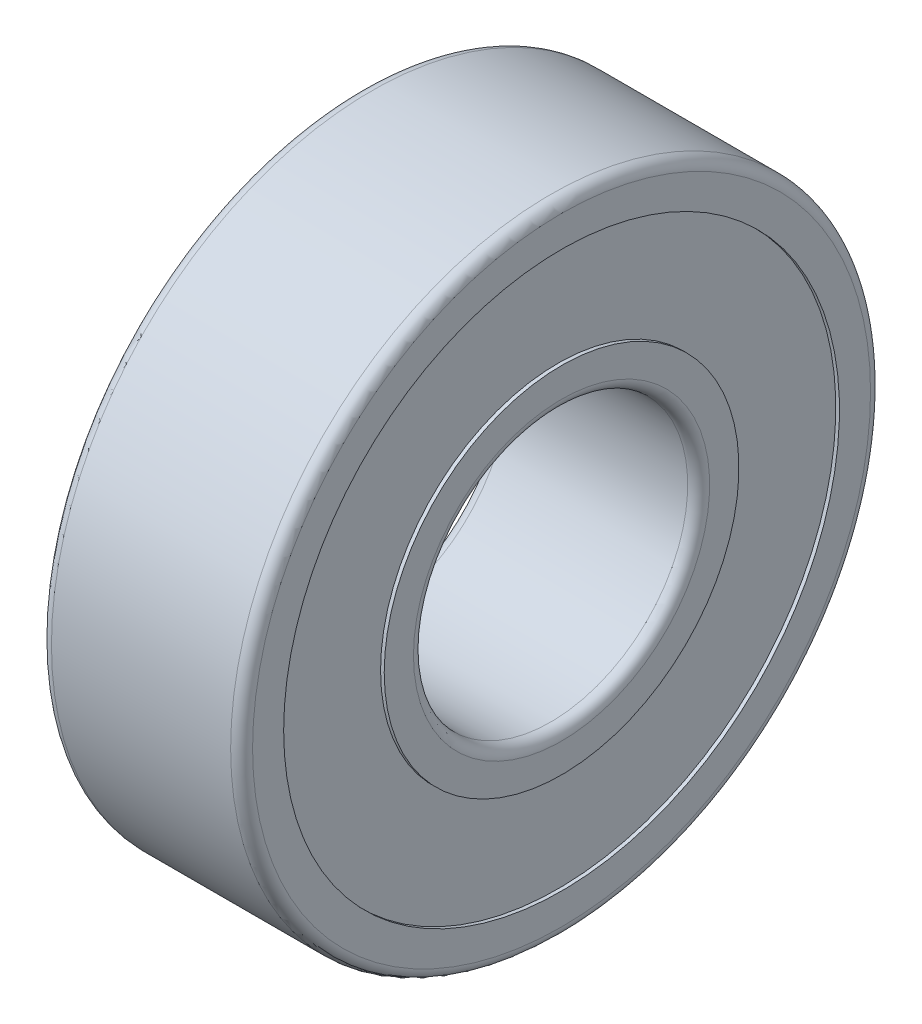
ISO-10303-21;
HEADER;
FILE_DESCRIPTION(('STEP AP214'),'2;1');
FILE_NAME('part.step','',(''),(''),'','','');
FILE_SCHEMA(('AUTOMOTIVE_DESIGN { 1 0 10303 214 1 1 1 1 }'));
ENDSEC;
DATA;
#1=APPLICATION_CONTEXT('core data for automotive mechanical design processes');
#2=APPLICATION_PROTOCOL_DEFINITION('international standard','automotive_design',2000,#1);
#3=PRODUCT_CONTEXT('',#1,'mechanical');
#4=PRODUCT('Part','Part','',(#3));
#5=PRODUCT_RELATED_PRODUCT_CATEGORY('part','',(#4));
#6=PRODUCT_DEFINITION_FORMATION('','',#4);
#7=PRODUCT_DEFINITION_CONTEXT('part definition',#1,'design');
#8=PRODUCT_DEFINITION('design','',#6,#7);
#9=PRODUCT_DEFINITION_SHAPE('','',#8);
#10=(LENGTH_UNIT() NAMED_UNIT(*) SI_UNIT(.MILLI.,.METRE.));
#11=(NAMED_UNIT(*) PLANE_ANGLE_UNIT() SI_UNIT($,.RADIAN.));
#12=(NAMED_UNIT(*) SI_UNIT($,.STERADIAN.) SOLID_ANGLE_UNIT());
#13=UNCERTAINTY_MEASURE_WITH_UNIT(LENGTH_MEASURE(1.E-05),#10,'distance_accuracy_value','');
#14=(GEOMETRIC_REPRESENTATION_CONTEXT(3) GLOBAL_UNCERTAINTY_ASSIGNED_CONTEXT((#13)) GLOBAL_UNIT_ASSIGNED_CONTEXT((#10,
#11,#12)) REPRESENTATION_CONTEXT('',''));
#15=CARTESIAN_POINT('',(0.,0.,0.));
#16=DIRECTION('',(0.,0.,1.));
#17=DIRECTION('',(1.,0.,0.));
#18=AXIS2_PLACEMENT_3D('',#15,#16,#17);
#19=CARTESIAN_POINT('',(0.,0.,0.));
#20=DIRECTION('',(-1.,0.,0.));
#21=DIRECTION('',(0.,0.,1.));
#22=AXIS2_PLACEMENT_3D('',#19,#20,#21);
#23=CYLINDRICAL_SURFACE('',#22,9.7);
#24=CARTESIAN_POINT('',(0.,0.,0.));
#25=DIRECTION('',(-1.,0.,0.));
#26=DIRECTION('',(0.,0.,1.));
#27=AXIS2_PLACEMENT_3D('',#24,#25,#26);
#28=CIRCLE('',#27,9.7);
#29=CARTESIAN_POINT('',(0.,0.,9.7));
#30=VERTEX_POINT('',#29);
#31=EDGE_CURVE('E63',#30,#30,#28,.T.);
#32=ORIENTED_EDGE('',*,*,#31,.F.);
#33=EDGE_LOOP('',(#32));
#34=FACE_BOUND('',#33,.T.);
#35=CARTESIAN_POINT('',(0.200000000000001,0.,0.));
#36=DIRECTION('',(-1.,0.,0.));
#37=DIRECTION('',(0.,0.,1.));
#38=AXIS2_PLACEMENT_3D('',#35,#36,#37);
#39=CIRCLE('',#38,9.7);
#40=CARTESIAN_POINT('',(0.200000000000001,0.,9.7));
#41=VERTEX_POINT('',#40);
#42=EDGE_CURVE('E84',#41,#41,#39,.T.);
#43=ORIENTED_EDGE('',*,*,#42,.T.);
#44=EDGE_LOOP('',(#43));
#45=FACE_BOUND('',#44,.T.);
#46=ADVANCED_FACE('F31',(#34,#45),#23,.T.);
#47=CARTESIAN_POINT('',(0.,9.7,0.));
#48=DIRECTION('',(1.,0.,0.));
#49=DIRECTION('',(0.,0.,-1.));
#50=AXIS2_PLACEMENT_3D('',#47,#48,#49);
#51=PLANE('',#50);
#52=CARTESIAN_POINT('',(0.,0.,0.));
#53=DIRECTION('',(1.,0.,0.));
#54=DIRECTION('',(0.,0.,-1.));
#55=AXIS2_PLACEMENT_3D('',#52,#53,#54);
#56=CIRCLE('',#55,8.1);
#57=CARTESIAN_POINT('',(0.,0.,-8.1));
#58=VERTEX_POINT('',#57);
#59=EDGE_CURVE('E54',#58,#58,#56,.T.);
#60=ORIENTED_EDGE('',*,*,#59,.T.);
#61=EDGE_LOOP('',(#60));
#62=FACE_BOUND('',#61,.T.);
#63=ORIENTED_EDGE('',*,*,#31,.T.);
#64=EDGE_LOOP('',(#63));
#65=FACE_BOUND('',#64,.T.);
#66=ADVANCED_FACE('F113',(#62,#65),#51,.F.);
#67=CARTESIAN_POINT('',(0.,0.,0.));
#68=DIRECTION('',(-1.,0.,0.));
#69=DIRECTION('',(0.,0.,1.));
#70=AXIS2_PLACEMENT_3D('',#67,#68,#69);
#71=CYLINDRICAL_SURFACE('',#70,7.5);
#72=CARTESIAN_POINT('',(0.6,0.,0.));
#73=DIRECTION('',(1.,0.,0.));
#74=DIRECTION('',(0.,0.,-1.));
#75=AXIS2_PLACEMENT_3D('',#72,#73,#74);
#76=CIRCLE('',#75,7.5);
#77=CARTESIAN_POINT('',(0.6,0.,-7.5));
#78=VERTEX_POINT('',#77);
#79=EDGE_CURVE('E57',#78,#78,#76,.F.);
#80=ORIENTED_EDGE('',*,*,#79,.T.);
#81=EDGE_LOOP('',(#80));
#82=FACE_BOUND('',#81,.T.);
#83=CARTESIAN_POINT('',(10.4,0.,0.));
#84=DIRECTION('',(-1.,0.,0.));
#85=DIRECTION('',(0.,0.,1.));
#86=AXIS2_PLACEMENT_3D('',#83,#84,#85);
#87=CIRCLE('',#86,7.5);
#88=CARTESIAN_POINT('',(10.4,0.,7.5));
#89=VERTEX_POINT('',#88);
#90=EDGE_CURVE('E60',#89,#89,#87,.F.);
#91=ORIENTED_EDGE('',*,*,#90,.T.);
#92=EDGE_LOOP('',(#91));
#93=FACE_BOUND('',#92,.T.);
#94=ADVANCED_FACE('F119',(#82,#93),#71,.F.);
#95=CARTESIAN_POINT('',(11.,7.5,0.));
#96=DIRECTION('',(-1.,0.,0.));
#97=DIRECTION('',(0.,0.,1.));
#98=AXIS2_PLACEMENT_3D('',#95,#96,#97);
#99=PLANE('',#98);
#100=CARTESIAN_POINT('',(11.,0.,0.));
#101=DIRECTION('',(-1.,0.,0.));
#102=DIRECTION('',(0.,0.,1.));
#103=AXIS2_PLACEMENT_3D('',#100,#101,#102);
#104=CIRCLE('',#103,8.1);
#105=CARTESIAN_POINT('',(11.,0.,8.1));
#106=VERTEX_POINT('',#105);
#107=EDGE_CURVE('E51',#106,#106,#104,.T.);
#108=ORIENTED_EDGE('',*,*,#107,.T.);
#109=EDGE_LOOP('',(#108));
#110=FACE_BOUND('',#109,.T.);
#111=CARTESIAN_POINT('',(11.,0.,0.));
#112=DIRECTION('',(-1.,0.,0.));
#113=DIRECTION('',(0.,0.,1.));
#114=AXIS2_PLACEMENT_3D('',#111,#112,#113);
#115=CIRCLE('',#114,9.7);
#116=CARTESIAN_POINT('',(11.,0.,9.7));
#117=VERTEX_POINT('',#116);
#118=EDGE_CURVE('E66',#117,#117,#115,.T.);
#119=ORIENTED_EDGE('',*,*,#118,.F.);
#120=EDGE_LOOP('',(#119));
#121=FACE_BOUND('',#120,.T.);
#122=ADVANCED_FACE('F189',(#110,#121),#99,.F.);
#123=CARTESIAN_POINT('',(0.,0.,0.));
#124=DIRECTION('',(-1.,0.,0.));
#125=DIRECTION('',(0.,0.,1.));
#126=AXIS2_PLACEMENT_3D('',#123,#124,#125);
#127=CYLINDRICAL_SURFACE('',#126,9.7);
#128=CARTESIAN_POINT('',(10.8,0.,0.));
#129=DIRECTION('',(-1.,0.,0.));
#130=DIRECTION('',(0.,0.,1.));
#131=AXIS2_PLACEMENT_3D('',#128,#129,#130);
#132=CIRCLE('',#131,9.7);
#133=CARTESIAN_POINT('',(10.8,0.,9.7));
#134=VERTEX_POINT('',#133);
#135=EDGE_CURVE('E69',#134,#134,#132,.T.);
#136=ORIENTED_EDGE('',*,*,#135,.F.);
#137=EDGE_LOOP('',(#136));
#138=FACE_BOUND('',#137,.T.);
#139=ORIENTED_EDGE('',*,*,#118,.T.);
#140=EDGE_LOOP('',(#139));
#141=FACE_BOUND('',#140,.T.);
#142=ADVANCED_FACE('F194',(#138,#141),#127,.T.);
#143=CARTESIAN_POINT('',(10.8,9.7,0.));
#144=DIRECTION('',(-1.,0.,0.));
#145=DIRECTION('',(0.,0.,1.));
#146=AXIS2_PLACEMENT_3D('',#143,#144,#145);
#147=PLANE('',#146);
#148=CARTESIAN_POINT('',(10.8,0.,0.));
#149=DIRECTION('',(-1.,0.,0.));
#150=DIRECTION('',(0.,0.,1.));
#151=AXIS2_PLACEMENT_3D('',#148,#149,#150);
#152=CIRCLE('',#151,15.2);
#153=CARTESIAN_POINT('',(10.8,0.,15.2));
#154=VERTEX_POINT('',#153);
#155=EDGE_CURVE('E72',#154,#154,#152,.T.);
#156=ORIENTED_EDGE('',*,*,#155,.F.);
#157=EDGE_LOOP('',(#156));
#158=FACE_BOUND('',#157,.T.);
#159=ORIENTED_EDGE('',*,*,#135,.T.);
#160=EDGE_LOOP('',(#159));
#161=FACE_BOUND('',#160,.T.);
#162=ADVANCED_FACE('F229',(#158,#161),#147,.F.);
#163=CARTESIAN_POINT('',(0.,0.,0.));
#164=DIRECTION('',(-1.,0.,0.));
#165=DIRECTION('',(0.,0.,1.));
#166=AXIS2_PLACEMENT_3D('',#163,#164,#165);
#167=CYLINDRICAL_SURFACE('',#166,15.2);
#168=CARTESIAN_POINT('',(11.,0.,0.));
#169=DIRECTION('',(-1.,0.,0.));
#170=DIRECTION('',(0.,0.,1.));
#171=AXIS2_PLACEMENT_3D('',#168,#169,#170);
#172=CIRCLE('',#171,15.2);
#173=CARTESIAN_POINT('',(11.,0.,15.2));
#174=VERTEX_POINT('',#173);
#175=EDGE_CURVE('E75',#174,#174,#172,.T.);
#176=ORIENTED_EDGE('',*,*,#175,.F.);
#177=EDGE_LOOP('',(#176));
#178=FACE_BOUND('',#177,.T.);
#179=ORIENTED_EDGE('',*,*,#155,.T.);
#180=EDGE_LOOP('',(#179));
#181=FACE_BOUND('',#180,.T.);
#182=ADVANCED_FACE('F182',(#178,#181),#167,.F.);
#183=CARTESIAN_POINT('',(11.,15.2,0.));
#184=DIRECTION('',(-1.,0.,0.));
#185=DIRECTION('',(0.,0.,1.));
#186=AXIS2_PLACEMENT_3D('',#183,#184,#185);
#187=PLANE('',#186);
#188=CARTESIAN_POINT('',(11.,0.,0.));
#189=DIRECTION('',(-1.,0.,0.));
#190=DIRECTION('',(0.,0.,1.));
#191=AXIS2_PLACEMENT_3D('',#188,#189,#190);
#192=CIRCLE('',#191,16.9);
#193=CARTESIAN_POINT('',(11.,0.,16.9));
#194=VERTEX_POINT('',#193);
#195=EDGE_CURVE('E38',#194,#194,#192,.F.);
#196=ORIENTED_EDGE('',*,*,#195,.T.);
#197=EDGE_LOOP('',(#196));
#198=FACE_BOUND('',#197,.T.);
#199=ORIENTED_EDGE('',*,*,#175,.T.);
#200=EDGE_LOOP('',(#199));
#201=FACE_BOUND('',#200,.T.);
#202=ADVANCED_FACE('F109',(#198,#201),#187,.F.);
#203=CARTESIAN_POINT('',(0.,0.,0.));
#204=DIRECTION('',(-1.,0.,0.));
#205=DIRECTION('',(0.,0.,1.));
#206=AXIS2_PLACEMENT_3D('',#203,#204,#205);
#207=CYLINDRICAL_SURFACE('',#206,17.5);
#208=CARTESIAN_POINT('',(10.4,0.,0.));
#209=DIRECTION('',(-1.,0.,0.));
#210=DIRECTION('',(0.,0.,1.));
#211=AXIS2_PLACEMENT_3D('',#208,#209,#210);
#212=CIRCLE('',#211,17.5);
#213=CARTESIAN_POINT('',(10.4,0.,17.5));
#214=VERTEX_POINT('',#213);
#215=EDGE_CURVE('E42',#214,#214,#212,.T.);
#216=ORIENTED_EDGE('',*,*,#215,.T.);
#217=EDGE_LOOP('',(#216));
#218=FACE_BOUND('',#217,.T.);
#219=CARTESIAN_POINT('',(0.6,0.,0.));
#220=DIRECTION('',(1.,0.,0.));
#221=DIRECTION('',(0.,0.,-1.));
#222=AXIS2_PLACEMENT_3D('',#219,#220,#221);
#223=CIRCLE('',#222,17.5);
#224=CARTESIAN_POINT('',(0.6,0.,-17.5));
#225=VERTEX_POINT('',#224);
#226=EDGE_CURVE('E46',#225,#225,#223,.T.);
#227=ORIENTED_EDGE('',*,*,#226,.T.);
#228=EDGE_LOOP('',(#227));
#229=FACE_BOUND('',#228,.T.);
#230=ADVANCED_FACE('F104',(#218,#229),#207,.T.);
#231=CARTESIAN_POINT('',(0.,17.5,0.));
#232=DIRECTION('',(1.,0.,0.));
#233=DIRECTION('',(0.,0.,-1.));
#234=AXIS2_PLACEMENT_3D('',#231,#232,#233);
#235=PLANE('',#234);
#236=CARTESIAN_POINT('',(0.,0.,0.));
#237=DIRECTION('',(1.,0.,0.));
#238=DIRECTION('',(0.,0.,-1.));
#239=AXIS2_PLACEMENT_3D('',#236,#237,#238);
#240=CIRCLE('',#239,16.9);
#241=CARTESIAN_POINT('',(0.,0.,-16.9));
#242=VERTEX_POINT('',#241);
#243=EDGE_CURVE('E10',#242,#242,#240,.F.);
#244=ORIENTED_EDGE('',*,*,#243,.T.);
#245=EDGE_LOOP('',(#244));
#246=FACE_BOUND('',#245,.T.);
#247=CARTESIAN_POINT('',(0.,0.,0.));
#248=DIRECTION('',(-1.,0.,0.));
#249=DIRECTION('',(0.,0.,1.));
#250=AXIS2_PLACEMENT_3D('',#247,#248,#249);
#251=CIRCLE('',#250,15.2);
#252=CARTESIAN_POINT('',(0.,0.,15.2));
#253=VERTEX_POINT('',#252);
#254=EDGE_CURVE('E78',#253,#253,#251,.T.);
#255=ORIENTED_EDGE('',*,*,#254,.F.);
#256=EDGE_LOOP('',(#255));
#257=FACE_BOUND('',#256,.T.);
#258=ADVANCED_FACE('F99',(#246,#257),#235,.F.);
#259=CARTESIAN_POINT('',(0.,0.,0.));
#260=DIRECTION('',(-1.,0.,0.));
#261=DIRECTION('',(0.,0.,1.));
#262=AXIS2_PLACEMENT_3D('',#259,#260,#261);
#263=CYLINDRICAL_SURFACE('',#262,15.2);
#264=CARTESIAN_POINT('',(0.2,0.,0.));
#265=DIRECTION('',(-1.,0.,0.));
#266=DIRECTION('',(0.,0.,1.));
#267=AXIS2_PLACEMENT_3D('',#264,#265,#266);
#268=CIRCLE('',#267,15.2);
#269=CARTESIAN_POINT('',(0.2,0.,15.2));
#270=VERTEX_POINT('',#269);
#271=EDGE_CURVE('E81',#270,#270,#268,.T.);
#272=ORIENTED_EDGE('',*,*,#271,.F.);
#273=EDGE_LOOP('',(#272));
#274=FACE_BOUND('',#273,.T.);
#275=ORIENTED_EDGE('',*,*,#254,.T.);
#276=EDGE_LOOP('',(#275));
#277=FACE_BOUND('',#276,.T.);
#278=ADVANCED_FACE('F93',(#274,#277),#263,.F.);
#279=CARTESIAN_POINT('',(0.200000000000001,15.2,0.));
#280=DIRECTION('',(1.,0.,0.));
#281=DIRECTION('',(0.,0.,-1.));
#282=AXIS2_PLACEMENT_3D('',#279,#280,#281);
#283=PLANE('',#282);
#284=ORIENTED_EDGE('',*,*,#42,.F.);
#285=EDGE_LOOP('',(#284));
#286=FACE_BOUND('',#285,.T.);
#287=ORIENTED_EDGE('',*,*,#271,.T.);
#288=EDGE_LOOP('',(#287));
#289=FACE_BOUND('',#288,.T.);
#290=ADVANCED_FACE('F89',(#286,#289),#283,.F.);
#291=CARTESIAN_POINT('',(0.6,0.,0.));
#292=DIRECTION('',(1.,0.,0.));
#293=DIRECTION('',(0.,0.,-1.));
#294=AXIS2_PLACEMENT_3D('',#291,#292,#293);
#295=TOROIDAL_SURFACE('',#294,8.1,0.6);
#296=ORIENTED_EDGE('',*,*,#59,.F.);
#297=EDGE_LOOP('',(#296));
#298=FACE_BOUND('',#297,.T.);
#299=ORIENTED_EDGE('',*,*,#79,.F.);
#300=EDGE_LOOP('',(#299));
#301=FACE_BOUND('',#300,.T.);
#302=ADVANCED_FACE('F92',(#298,#301),#295,.T.);
#303=CARTESIAN_POINT('',(10.4,0.,0.));
#304=DIRECTION('',(-1.,0.,0.));
#305=DIRECTION('',(0.,0.,1.));
#306=AXIS2_PLACEMENT_3D('',#303,#304,#305);
#307=TOROIDAL_SURFACE('',#306,8.1,0.6);
#308=ORIENTED_EDGE('',*,*,#90,.F.);
#309=EDGE_LOOP('',(#308));
#310=FACE_BOUND('',#309,.T.);
#311=ORIENTED_EDGE('',*,*,#107,.F.);
#312=EDGE_LOOP('',(#311));
#313=FACE_BOUND('',#312,.T.);
#314=ADVANCED_FACE('F127',(#310,#313),#307,.T.);
#315=CARTESIAN_POINT('',(10.4,0.,0.));
#316=DIRECTION('',(-1.,0.,0.));
#317=DIRECTION('',(0.,0.,1.));
#318=AXIS2_PLACEMENT_3D('',#315,#316,#317);
#319=TOROIDAL_SURFACE('',#318,16.9,0.6);
#320=ORIENTED_EDGE('',*,*,#195,.F.);
#321=EDGE_LOOP('',(#320));
#322=FACE_BOUND('',#321,.T.);
#323=ORIENTED_EDGE('',*,*,#215,.F.);
#324=EDGE_LOOP('',(#323));
#325=FACE_BOUND('',#324,.T.);
#326=ADVANCED_FACE('F130',(#322,#325),#319,.T.);
#327=CARTESIAN_POINT('',(0.6,0.,0.));
#328=DIRECTION('',(1.,0.,0.));
#329=DIRECTION('',(0.,0.,-1.));
#330=AXIS2_PLACEMENT_3D('',#327,#328,#329);
#331=TOROIDAL_SURFACE('',#330,16.9,0.6);
#332=ORIENTED_EDGE('',*,*,#226,.F.);
#333=EDGE_LOOP('',(#332));
#334=FACE_BOUND('',#333,.T.);
#335=ORIENTED_EDGE('',*,*,#243,.F.);
#336=EDGE_LOOP('',(#335));
#337=FACE_BOUND('',#336,.T.);
#338=ADVANCED_FACE('F33',(#334,#337),#331,.T.);
#339=CLOSED_SHELL('',(#46,#66,#94,#122,#142,#162,#182,#202,#230,#258,#278,#290,#302,#314,#326,#338));
#340=MANIFOLD_SOLID_BREP('B2',#339);
#341=ADVANCED_BREP_SHAPE_REPRESENTATION('',(#18,#340),#14);
#342=SHAPE_DEFINITION_REPRESENTATION(#9,#341);
ENDSEC;
END-ISO-10303-21;
